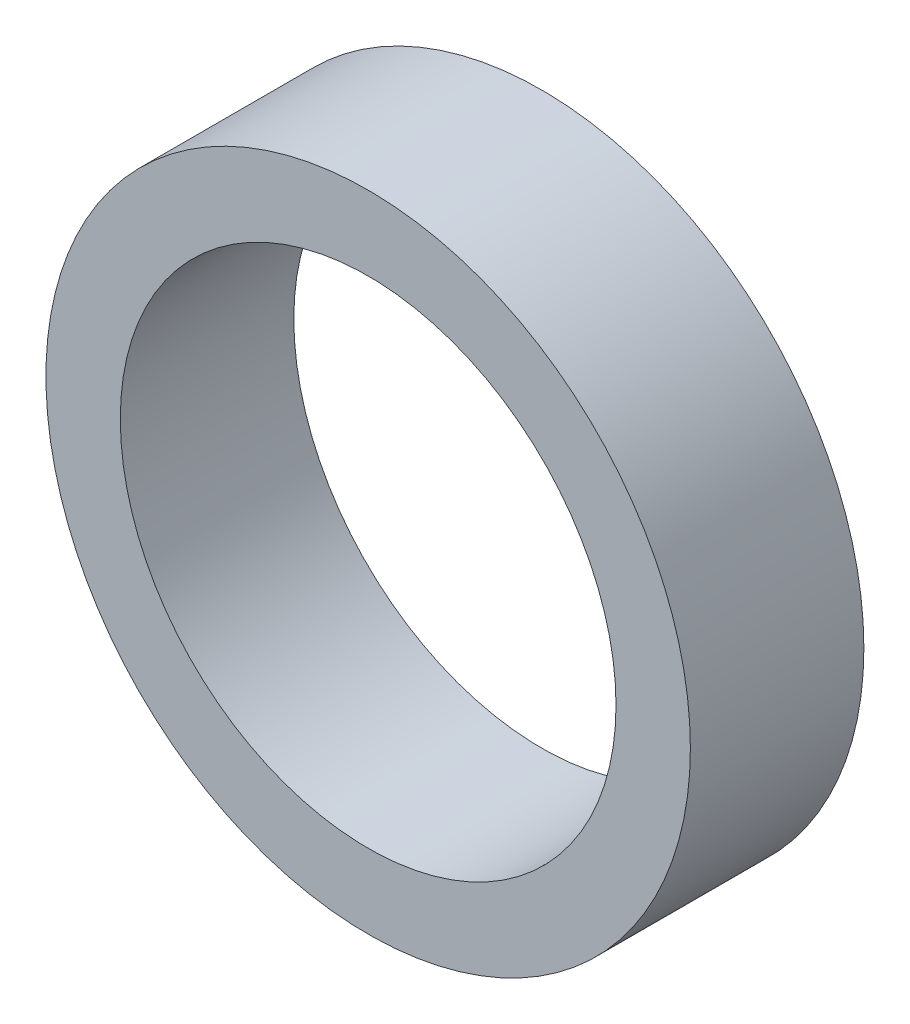
ISO-10303-21;
HEADER;
FILE_DESCRIPTION(('STEP AP214'),'2;1');
FILE_NAME('part.step','',(''),(''),'','','');
FILE_SCHEMA(('AUTOMOTIVE_DESIGN { 1 0 10303 214 1 1 1 1 }'));
ENDSEC;
DATA;
#1=APPLICATION_CONTEXT('core data for automotive mechanical design processes');
#2=APPLICATION_PROTOCOL_DEFINITION('international standard','automotive_design',2000,#1);
#3=PRODUCT_CONTEXT('',#1,'mechanical');
#4=PRODUCT('Part','Part','',(#3));
#5=PRODUCT_RELATED_PRODUCT_CATEGORY('part','',(#4));
#6=PRODUCT_DEFINITION_FORMATION('','',#4);
#7=PRODUCT_DEFINITION_CONTEXT('part definition',#1,'design');
#8=PRODUCT_DEFINITION('design','',#6,#7);
#9=PRODUCT_DEFINITION_SHAPE('','',#8);
#10=(LENGTH_UNIT() NAMED_UNIT(*) SI_UNIT(.MILLI.,.METRE.));
#11=(NAMED_UNIT(*) PLANE_ANGLE_UNIT() SI_UNIT($,.RADIAN.));
#12=(NAMED_UNIT(*) SI_UNIT($,.STERADIAN.) SOLID_ANGLE_UNIT());
#13=UNCERTAINTY_MEASURE_WITH_UNIT(LENGTH_MEASURE(1.E-05),#10,'distance_accuracy_value','');
#14=(GEOMETRIC_REPRESENTATION_CONTEXT(3) GLOBAL_UNCERTAINTY_ASSIGNED_CONTEXT((#13)) GLOBAL_UNIT_ASSIGNED_CONTEXT((#10,
#11,#12)) REPRESENTATION_CONTEXT('',''));
#15=CARTESIAN_POINT('',(0.,0.,0.));
#16=DIRECTION('',(0.,0.,1.));
#17=DIRECTION('',(1.,0.,0.));
#18=AXIS2_PLACEMENT_3D('',#15,#16,#17);
#19=CARTESIAN_POINT('',(0.,0.,7.));
#20=DIRECTION('',(0.,0.,1.));
#21=DIRECTION('',(1.,0.,0.));
#22=AXIS2_PLACEMENT_3D('',#19,#20,#21);
#23=PLANE('',#22);
#24=CARTESIAN_POINT('',(0.,0.,7.));
#25=DIRECTION('',(0.,0.,1.));
#26=DIRECTION('',(1.,0.,0.));
#27=AXIS2_PLACEMENT_3D('',#24,#25,#26);
#28=CIRCLE('',#27,13.);
#29=CARTESIAN_POINT('',(13.,0.,7.));
#30=VERTEX_POINT('',#29);
#31=EDGE_CURVE('E10',#30,#30,#28,.T.);
#32=ORIENTED_EDGE('',*,*,#31,.T.);
#33=EDGE_LOOP('',(#32));
#34=FACE_BOUND('',#33,.T.);
#35=CARTESIAN_POINT('',(0.,0.,7.));
#36=DIRECTION('',(0.,0.,1.));
#37=DIRECTION('',(1.,0.,0.));
#38=AXIS2_PLACEMENT_3D('',#35,#36,#37);
#39=CIRCLE('',#38,10.);
#40=CARTESIAN_POINT('',(10.,0.,7.));
#41=VERTEX_POINT('',#40);
#42=EDGE_CURVE('E50',#41,#41,#39,.T.);
#43=ORIENTED_EDGE('',*,*,#42,.F.);
#44=EDGE_LOOP('',(#43));
#45=FACE_BOUND('',#44,.T.);
#46=ADVANCED_FACE('F37',(#34,#45),#23,.T.);
#47=CARTESIAN_POINT('',(0.,0.,0.));
#48=DIRECTION('',(0.,0.,1.));
#49=DIRECTION('',(1.,0.,0.));
#50=AXIS2_PLACEMENT_3D('',#47,#48,#49);
#51=PLANE('',#50);
#52=CARTESIAN_POINT('',(0.,0.,0.));
#53=DIRECTION('',(0.,0.,1.));
#54=DIRECTION('',(1.,0.,0.));
#55=AXIS2_PLACEMENT_3D('',#52,#53,#54);
#56=CIRCLE('',#55,13.);
#57=CARTESIAN_POINT('',(13.,0.,0.));
#58=VERTEX_POINT('',#57);
#59=EDGE_CURVE('E41',#58,#58,#56,.T.);
#60=ORIENTED_EDGE('',*,*,#59,.F.);
#61=EDGE_LOOP('',(#60));
#62=FACE_BOUND('',#61,.T.);
#63=CARTESIAN_POINT('',(0.,0.,0.));
#64=DIRECTION('',(0.,0.,1.));
#65=DIRECTION('',(1.,0.,0.));
#66=AXIS2_PLACEMENT_3D('',#63,#64,#65);
#67=CIRCLE('',#66,10.);
#68=CARTESIAN_POINT('',(10.,0.,0.));
#69=VERTEX_POINT('',#68);
#70=EDGE_CURVE('E52',#69,#69,#67,.T.);
#71=ORIENTED_EDGE('',*,*,#70,.T.);
#72=EDGE_LOOP('',(#71));
#73=FACE_BOUND('',#72,.T.);
#74=ADVANCED_FACE('F64',(#62,#73),#51,.F.);
#75=CARTESIAN_POINT('',(0.,0.,7.));
#76=DIRECTION('',(0.,0.,-1.));
#77=DIRECTION('',(-1.,0.,0.));
#78=AXIS2_PLACEMENT_3D('',#75,#76,#77);
#79=CYLINDRICAL_SURFACE('',#78,13.);
#80=ORIENTED_EDGE('',*,*,#31,.F.);
#81=EDGE_LOOP('',(#80));
#82=FACE_BOUND('',#81,.T.);
#83=ORIENTED_EDGE('',*,*,#59,.T.);
#84=EDGE_LOOP('',(#83));
#85=FACE_BOUND('',#84,.T.);
#86=ADVANCED_FACE('F39',(#82,#85),#79,.T.);
#87=CARTESIAN_POINT('',(0.,0.,7.));
#88=DIRECTION('',(0.,0.,-1.));
#89=DIRECTION('',(-1.,0.,0.));
#90=AXIS2_PLACEMENT_3D('',#87,#88,#89);
#91=CYLINDRICAL_SURFACE('',#90,10.);
#92=ORIENTED_EDGE('',*,*,#42,.T.);
#93=EDGE_LOOP('',(#92));
#94=FACE_BOUND('',#93,.T.);
#95=ORIENTED_EDGE('',*,*,#70,.F.);
#96=EDGE_LOOP('',(#95));
#97=FACE_BOUND('',#96,.T.);
#98=ADVANCED_FACE('F60',(#94,#97),#91,.F.);
#99=CLOSED_SHELL('',(#46,#74,#86,#98));
#100=MANIFOLD_SOLID_BREP('B2',#99);
#101=ADVANCED_BREP_SHAPE_REPRESENTATION('',(#18,#100),#14);
#102=SHAPE_DEFINITION_REPRESENTATION(#9,#101);
ENDSEC;
END-ISO-10303-21;
